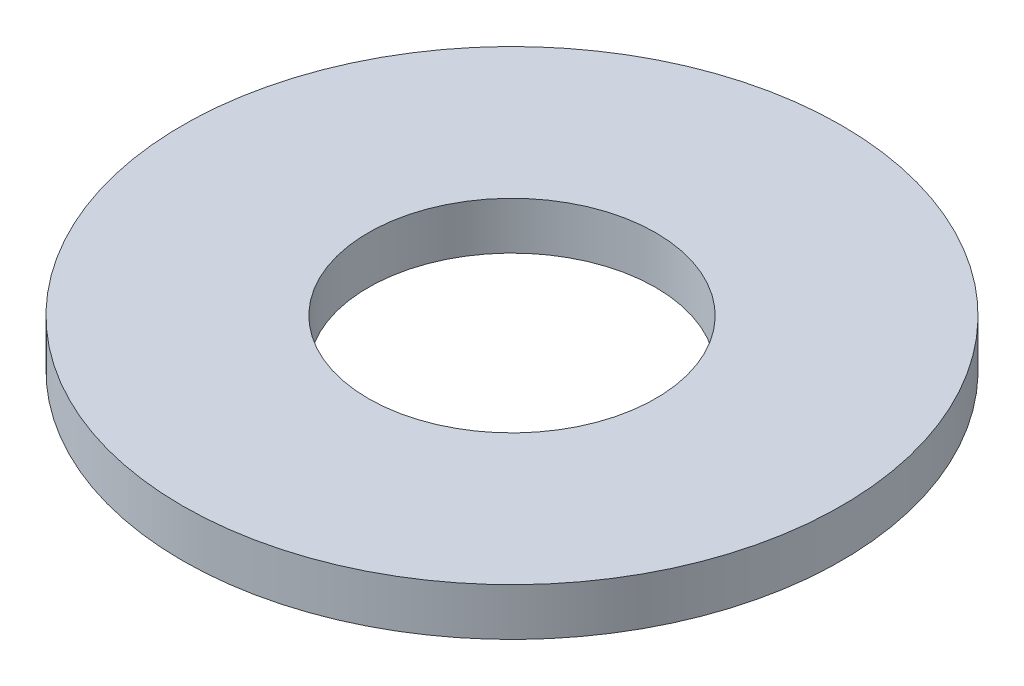
ISO-10303-21;
HEADER;
FILE_DESCRIPTION(('STEP AP214'),'2;1');
FILE_NAME('part.step','',(''),(''),'','','');
FILE_SCHEMA(('AUTOMOTIVE_DESIGN { 1 0 10303 214 1 1 1 1 }'));
ENDSEC;
DATA;
#1=APPLICATION_CONTEXT('core data for automotive mechanical design processes');
#2=APPLICATION_PROTOCOL_DEFINITION('international standard','automotive_design',2000,#1);
#3=PRODUCT_CONTEXT('',#1,'mechanical');
#4=PRODUCT('Part','Part','',(#3));
#5=PRODUCT_RELATED_PRODUCT_CATEGORY('part','',(#4));
#6=PRODUCT_DEFINITION_FORMATION('','',#4);
#7=PRODUCT_DEFINITION_CONTEXT('part definition',#1,'design');
#8=PRODUCT_DEFINITION('design','',#6,#7);
#9=PRODUCT_DEFINITION_SHAPE('','',#8);
#10=(LENGTH_UNIT() NAMED_UNIT(*) SI_UNIT(.MILLI.,.METRE.));
#11=(NAMED_UNIT(*) PLANE_ANGLE_UNIT() SI_UNIT($,.RADIAN.));
#12=(NAMED_UNIT(*) SI_UNIT($,.STERADIAN.) SOLID_ANGLE_UNIT());
#13=UNCERTAINTY_MEASURE_WITH_UNIT(LENGTH_MEASURE(1.E-05),#10,'distance_accuracy_value','');
#14=(GEOMETRIC_REPRESENTATION_CONTEXT(3) GLOBAL_UNCERTAINTY_ASSIGNED_CONTEXT((#13)) GLOBAL_UNIT_ASSIGNED_CONTEXT((#10,
#11,#12)) REPRESENTATION_CONTEXT('',''));
#15=CARTESIAN_POINT('',(0.,0.,0.));
#16=DIRECTION('',(0.,0.,1.));
#17=DIRECTION('',(1.,0.,0.));
#18=AXIS2_PLACEMENT_3D('',#15,#16,#17);
#19=CARTESIAN_POINT('',(0.,0.4572,0.));
#20=DIRECTION('',(0.,-1.,0.));
#21=DIRECTION('',(0.,0.,-1.));
#22=AXIS2_PLACEMENT_3D('',#19,#20,#21);
#23=CYLINDRICAL_SURFACE('',#22,3.175);
#24=CARTESIAN_POINT('',(0.,0.4572,0.));
#25=DIRECTION('',(0.,1.,0.));
#26=DIRECTION('',(0.,0.,1.));
#27=AXIS2_PLACEMENT_3D('',#24,#25,#26);
#28=CIRCLE('',#27,3.175);
#29=CARTESIAN_POINT('',(0.,0.4572,3.175));
#30=VERTEX_POINT('',#29);
#31=EDGE_CURVE('E10',#30,#30,#28,.T.);
#32=ORIENTED_EDGE('',*,*,#31,.F.);
#33=EDGE_LOOP('',(#32));
#34=FACE_BOUND('',#33,.T.);
#35=CARTESIAN_POINT('',(0.,0.,0.));
#36=DIRECTION('',(0.,1.,0.));
#37=DIRECTION('',(0.,0.,1.));
#38=AXIS2_PLACEMENT_3D('',#35,#36,#37);
#39=CIRCLE('',#38,3.175);
#40=CARTESIAN_POINT('',(0.,0.,3.175));
#41=VERTEX_POINT('',#40);
#42=EDGE_CURVE('E35',#41,#41,#39,.T.);
#43=ORIENTED_EDGE('',*,*,#42,.T.);
#44=EDGE_LOOP('',(#43));
#45=FACE_BOUND('',#44,.T.);
#46=ADVANCED_FACE('F32',(#34,#45),#23,.T.);
#47=CARTESIAN_POINT('',(0.,0.4572,0.));
#48=DIRECTION('',(0.,1.,0.));
#49=DIRECTION('',(0.,0.,1.));
#50=AXIS2_PLACEMENT_3D('',#47,#48,#49);
#51=PLANE('',#50);
#52=CARTESIAN_POINT('',(0.,0.4572,0.));
#53=DIRECTION('',(0.,1.,0.));
#54=DIRECTION('',(0.,0.,1.));
#55=AXIS2_PLACEMENT_3D('',#52,#53,#54);
#56=CIRCLE('',#55,1.3843);
#57=CARTESIAN_POINT('',(0.,0.4572,1.3843));
#58=VERTEX_POINT('',#57);
#59=EDGE_CURVE('E44',#58,#58,#56,.T.);
#60=ORIENTED_EDGE('',*,*,#59,.F.);
#61=EDGE_LOOP('',(#60));
#62=FACE_BOUND('',#61,.T.);
#63=ORIENTED_EDGE('',*,*,#31,.T.);
#64=EDGE_LOOP('',(#63));
#65=FACE_BOUND('',#64,.T.);
#66=ADVANCED_FACE('F59',(#62,#65),#51,.T.);
#67=CARTESIAN_POINT('',(0.,0.,0.));
#68=DIRECTION('',(0.,1.,0.));
#69=DIRECTION('',(0.,0.,1.));
#70=AXIS2_PLACEMENT_3D('',#67,#68,#69);
#71=PLANE('',#70);
#72=CARTESIAN_POINT('',(0.,0.,0.));
#73=DIRECTION('',(0.,1.,0.));
#74=DIRECTION('',(0.,0.,1.));
#75=AXIS2_PLACEMENT_3D('',#72,#73,#74);
#76=CIRCLE('',#75,1.3843);
#77=CARTESIAN_POINT('',(0.,0.,1.3843));
#78=VERTEX_POINT('',#77);
#79=EDGE_CURVE('E42',#78,#78,#76,.T.);
#80=ORIENTED_EDGE('',*,*,#79,.T.);
#81=EDGE_LOOP('',(#80));
#82=FACE_BOUND('',#81,.T.);
#83=ORIENTED_EDGE('',*,*,#42,.F.);
#84=EDGE_LOOP('',(#83));
#85=FACE_BOUND('',#84,.T.);
#86=ADVANCED_FACE('F50',(#82,#85),#71,.F.);
#87=CARTESIAN_POINT('',(0.,0.,0.));
#88=DIRECTION('',(0.,1.,0.));
#89=DIRECTION('',(0.,0.,1.));
#90=AXIS2_PLACEMENT_3D('',#87,#88,#89);
#91=CYLINDRICAL_SURFACE('',#90,1.3843);
#92=ORIENTED_EDGE('',*,*,#79,.F.);
#93=EDGE_LOOP('',(#92));
#94=FACE_BOUND('',#93,.T.);
#95=ORIENTED_EDGE('',*,*,#59,.T.);
#96=EDGE_LOOP('',(#95));
#97=FACE_BOUND('',#96,.T.);
#98=ADVANCED_FACE('F53',(#94,#97),#91,.F.);
#99=CLOSED_SHELL('',(#46,#66,#86,#98));
#100=MANIFOLD_SOLID_BREP('B2',#99);
#101=ADVANCED_BREP_SHAPE_REPRESENTATION('',(#18,#100),#14);
#102=SHAPE_DEFINITION_REPRESENTATION(#9,#101);
ENDSEC;
END-ISO-10303-21;
